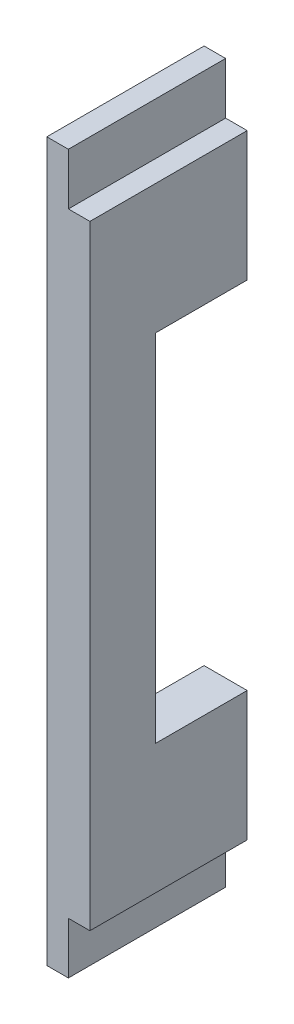
ISO-10303-21;
HEADER;
FILE_DESCRIPTION(('STEP AP214'),'2;1');
FILE_NAME('part.step','',(''),(''),'','','');
FILE_SCHEMA(('AUTOMOTIVE_DESIGN { 1 0 10303 214 1 1 1 1 }'));
ENDSEC;
DATA;
#1=APPLICATION_CONTEXT('core data for automotive mechanical design processes');
#2=APPLICATION_PROTOCOL_DEFINITION('international standard','automotive_design',2000,#1);
#3=PRODUCT_CONTEXT('',#1,'mechanical');
#4=PRODUCT('Part','Part','',(#3));
#5=PRODUCT_RELATED_PRODUCT_CATEGORY('part','',(#4));
#6=PRODUCT_DEFINITION_FORMATION('','',#4);
#7=PRODUCT_DEFINITION_CONTEXT('part definition',#1,'design');
#8=PRODUCT_DEFINITION('design','',#6,#7);
#9=PRODUCT_DEFINITION_SHAPE('','',#8);
#10=(LENGTH_UNIT() NAMED_UNIT(*) SI_UNIT(.MILLI.,.METRE.));
#11=(NAMED_UNIT(*) PLANE_ANGLE_UNIT() SI_UNIT($,.RADIAN.));
#12=(NAMED_UNIT(*) SI_UNIT($,.STERADIAN.) SOLID_ANGLE_UNIT());
#13=UNCERTAINTY_MEASURE_WITH_UNIT(LENGTH_MEASURE(1.E-05),#10,'distance_accuracy_value','');
#14=(GEOMETRIC_REPRESENTATION_CONTEXT(3) GLOBAL_UNCERTAINTY_ASSIGNED_CONTEXT((#13)) GLOBAL_UNIT_ASSIGNED_CONTEXT((#10,
#11,#12)) REPRESENTATION_CONTEXT('',''));
#15=CARTESIAN_POINT('',(0.,0.,0.));
#16=DIRECTION('',(0.,0.,1.));
#17=DIRECTION('',(1.,0.,0.));
#18=AXIS2_PLACEMENT_3D('',#15,#16,#17);
#19=CARTESIAN_POINT('',(-196.686091028777,-278.025070596186,-866.48578652296));
#20=DIRECTION('',(0.,1.,0.));
#21=DIRECTION('',(-1.,0.,0.));
#22=AXIS2_PLACEMENT_3D('',#19,#20,#21);
#23=PLANE('',#22);
#24=DIRECTION('',(1.,0.,0.));
#25=VECTOR('',#24,1.);
#26=CARTESIAN_POINT('',(-316.686091028779,-278.025070596186,-899.48578652296));
#27=LINE('',#26,#25);
#28=CARTESIAN_POINT('',(-306.686091028778,-278.025070596186,-899.48578652296));
#29=VERTEX_POINT('',#28);
#30=CARTESIAN_POINT('',(-316.686091028776,-278.025070596186,-899.48578652296));
#31=VERTEX_POINT('',#30);
#32=EDGE_CURVE('E120',#29,#31,#27,.F.);
#33=ORIENTED_EDGE('',*,*,#32,.T.);
#34=DIRECTION('',(0.,0.,1.));
#35=VECTOR('',#34,1.);
#36=CARTESIAN_POINT('',(-316.686091028776,-278.025070596186,-866.48578652296));
#37=LINE('',#36,#35);
#38=CARTESIAN_POINT('',(-316.686091028776,-278.025070596186,-826.485786522959));
#39=VERTEX_POINT('',#38);
#40=EDGE_CURVE('E121',#39,#31,#37,.F.);
#41=ORIENTED_EDGE('',*,*,#40,.F.);
#42=DIRECTION('',(-1.,0.,0.));
#43=VECTOR('',#42,1.);
#44=CARTESIAN_POINT('',(-316.686091028776,-278.025070596186,-826.485786522959));
#45=LINE('',#44,#43);
#46=CARTESIAN_POINT('',(-306.686091028778,-278.025070596186,-826.485786522959));
#47=VERTEX_POINT('',#46);
#48=EDGE_CURVE('E137',#39,#47,#45,.F.);
#49=ORIENTED_EDGE('',*,*,#48,.T.);
#50=DIRECTION('',(0.,0.,1.));
#51=VECTOR('',#50,1.);
#52=CARTESIAN_POINT('',(-306.686091028778,-278.025070596186,-868.98578652296));
#53=LINE('',#52,#51);
#54=EDGE_CURVE('E147',#47,#29,#53,.F.);
#55=ORIENTED_EDGE('',*,*,#54,.T.);
#56=EDGE_LOOP('',(#33,#41,#49,#55));
#57=FACE_BOUND('',#56,.T.);
#58=ADVANCED_FACE('F17',(#57),#23,.T.);
#59=CARTESIAN_POINT('',(-306.686091028778,-420.602297752566,-868.98578652296));
#60=DIRECTION('',(-1.,0.,0.));
#61=DIRECTION('',(0.,0.,1.));
#62=AXIS2_PLACEMENT_3D('',#59,#60,#61);
#63=PLANE('',#62);
#64=DIRECTION('',(0.,1.,0.));
#65=VECTOR('',#64,1.);
#66=CARTESIAN_POINT('',(-306.686091028778,-420.602297752566,-826.485786522959));
#67=LINE('',#66,#65);
#68=CARTESIAN_POINT('',(-306.686091028778,-563.179524908949,-826.485786522959));
#69=VERTEX_POINT('',#68);
#70=EDGE_CURVE('E134',#47,#69,#67,.F.);
#71=ORIENTED_EDGE('',*,*,#70,.T.);
#72=DIRECTION('',(0.,0.,-1.));
#73=VECTOR('',#72,1.);
#74=CARTESIAN_POINT('',(-306.686091028778,-563.179524908949,-866.48578652296));
#75=LINE('',#74,#73);
#76=CARTESIAN_POINT('',(-306.686091028778,-563.179524908949,-899.48578652296));
#77=VERTEX_POINT('',#76);
#78=EDGE_CURVE('E149',#77,#69,#75,.F.);
#79=ORIENTED_EDGE('',*,*,#78,.F.);
#80=DIRECTION('',(0.,1.,0.));
#81=VECTOR('',#80,1.);
#82=CARTESIAN_POINT('',(-306.686091028778,-420.602297752566,-899.48578652296));
#83=LINE('',#82,#81);
#84=CARTESIAN_POINT('',(-306.686092270153,-503.102285385131,-899.48578652296));
#85=VERTEX_POINT('',#84);
#86=EDGE_CURVE('E179',#77,#85,#83,.T.);
#87=ORIENTED_EDGE('',*,*,#86,.T.);
#88=DIRECTION('',(0.,0.,-1.));
#89=VECTOR('',#88,1.);
#90=CARTESIAN_POINT('',(-306.686095994277,-503.102285385131,-881.985844802857));
#91=LINE('',#90,#89);
#92=CARTESIAN_POINT('',(-306.686091028778,-503.102285385131,-856.985868835449));
#93=VERTEX_POINT('',#92);
#94=EDGE_CURVE('E131',#85,#93,#91,.F.);
#95=ORIENTED_EDGE('',*,*,#94,.T.);
#96=DIRECTION('',(0.,1.,0.));
#97=VECTOR('',#96,1.);
#98=CARTESIAN_POINT('',(-306.686091028778,-420.602282333374,-856.985868835449));
#99=LINE('',#98,#97);
#100=CARTESIAN_POINT('',(-306.686091028778,-338.102279281615,-856.985868835449));
#101=VERTEX_POINT('',#100);
#102=EDGE_CURVE('E103',#93,#101,#99,.T.);
#103=ORIENTED_EDGE('',*,*,#102,.T.);
#104=DIRECTION('',(0.,0.,1.));
#105=VECTOR('',#104,1.);
#106=CARTESIAN_POINT('',(-306.686091028778,-338.102279281615,-868.98578652296));
#107=LINE('',#106,#105);
#108=CARTESIAN_POINT('',(-306.686091028778,-338.102279281615,-899.48578652296));
#109=VERTEX_POINT('',#108);
#110=EDGE_CURVE('E20',#101,#109,#107,.F.);
#111=ORIENTED_EDGE('',*,*,#110,.T.);
#112=DIRECTION('',(0.,1.,0.));
#113=VECTOR('',#112,1.);
#114=CARTESIAN_POINT('',(-306.686091028778,-420.602297752566,-899.48578652296));
#115=LINE('',#114,#113);
#116=EDGE_CURVE('E109',#109,#29,#115,.T.);
#117=ORIENTED_EDGE('',*,*,#116,.T.);
#118=ORIENTED_EDGE('',*,*,#54,.F.);
#119=EDGE_LOOP('',(#71,#79,#87,#95,#103,#111,#117,#118));
#120=FACE_BOUND('',#119,.T.);
#121=ADVANCED_FACE('F107',(#120),#63,.F.);
#122=CARTESIAN_POINT('',(-196.679347611489,-563.179524908949,-866.48578652296));
#123=DIRECTION('',(0.,-1.,0.));
#124=DIRECTION('',(0.,0.,-1.));
#125=AXIS2_PLACEMENT_3D('',#122,#123,#124);
#126=PLANE('',#125);
#127=DIRECTION('',(1.,0.,0.));
#128=VECTOR('',#127,1.);
#129=CARTESIAN_POINT('',(-316.686091028776,-563.179524908949,-899.48578652296));
#130=LINE('',#129,#128);
#131=CARTESIAN_POINT('',(-316.679347611488,-563.179524908949,-899.48578652296));
#132=VERTEX_POINT('',#131);
#133=EDGE_CURVE('E159',#132,#77,#130,.T.);
#134=ORIENTED_EDGE('',*,*,#133,.T.);
#135=ORIENTED_EDGE('',*,*,#78,.T.);
#136=DIRECTION('',(-1.,0.,0.));
#137=VECTOR('',#136,1.);
#138=CARTESIAN_POINT('',(-316.686091028776,-563.179524908949,-826.485786522959));
#139=LINE('',#138,#137);
#140=CARTESIAN_POINT('',(-316.679347611488,-563.179524908949,-826.485786522959));
#141=VERTEX_POINT('',#140);
#142=EDGE_CURVE('E136',#69,#141,#139,.T.);
#143=ORIENTED_EDGE('',*,*,#142,.T.);
#144=DIRECTION('',(0.,0.,1.));
#145=VECTOR('',#144,1.);
#146=CARTESIAN_POINT('',(-316.679347611488,-563.179524908949,-866.48578652296));
#147=LINE('',#146,#145);
#148=EDGE_CURVE('E172',#141,#132,#147,.F.);
#149=ORIENTED_EDGE('',*,*,#148,.T.);
#150=EDGE_LOOP('',(#134,#135,#143,#149));
#151=FACE_BOUND('',#150,.T.);
#152=ADVANCED_FACE('F229',(#151),#126,.T.);
#153=CARTESIAN_POINT('',(-316.679347611488,-575.179524908949,-866.48578652296));
#154=DIRECTION('',(-1.,0.,0.));
#155=DIRECTION('',(0.,0.,1.));
#156=AXIS2_PLACEMENT_3D('',#153,#154,#155);
#157=PLANE('',#156);
#158=DIRECTION('',(0.,0.,1.));
#159=VECTOR('',#158,1.);
#160=CARTESIAN_POINT('',(-316.679347611488,-587.179524908949,-868.98578652296));
#161=LINE('',#160,#159);
#162=CARTESIAN_POINT('',(-316.679347611488,-587.179524908949,-826.485786522959));
#163=VERTEX_POINT('',#162);
#164=CARTESIAN_POINT('',(-316.679347611488,-587.179524908949,-899.48578652296));
#165=VERTEX_POINT('',#164);
#166=EDGE_CURVE('E141',#163,#165,#161,.F.);
#167=ORIENTED_EDGE('',*,*,#166,.T.);
#168=DIRECTION('',(0.,1.,0.));
#169=VECTOR('',#168,1.);
#170=CARTESIAN_POINT('',(-316.679347611488,-420.602297752566,-899.48578652296));
#171=LINE('',#170,#169);
#172=EDGE_CURVE('E183',#165,#132,#171,.T.);
#173=ORIENTED_EDGE('',*,*,#172,.T.);
#174=ORIENTED_EDGE('',*,*,#148,.F.);
#175=DIRECTION('',(0.,1.,0.));
#176=VECTOR('',#175,1.);
#177=CARTESIAN_POINT('',(-316.679347611488,-420.602297752566,-826.485786522959));
#178=LINE('',#177,#176);
#179=EDGE_CURVE('E191',#141,#163,#178,.F.);
#180=ORIENTED_EDGE('',*,*,#179,.T.);
#181=EDGE_LOOP('',(#167,#173,#174,#180));
#182=FACE_BOUND('',#181,.T.);
#183=ADVANCED_FACE('F225',(#182),#157,.F.);
#184=CARTESIAN_POINT('',(-316.686091028776,-266.025070596186,-866.48578652296));
#185=DIRECTION('',(1.,0.,0.));
#186=DIRECTION('',(0.,1.,0.));
#187=AXIS2_PLACEMENT_3D('',#184,#185,#186);
#188=PLANE('',#187);
#189=DIRECTION('',(0.,1.,0.));
#190=VECTOR('',#189,1.);
#191=CARTESIAN_POINT('',(-316.686091028776,-420.602297752566,-899.48578652296));
#192=LINE('',#191,#190);
#193=CARTESIAN_POINT('',(-316.686091028776,-254.025070596186,-899.48578652296));
#194=VERTEX_POINT('',#193);
#195=EDGE_CURVE('E115',#31,#194,#192,.T.);
#196=ORIENTED_EDGE('',*,*,#195,.T.);
#197=DIRECTION('',(0.,0.,-1.));
#198=VECTOR('',#197,1.);
#199=CARTESIAN_POINT('',(-316.686091028776,-254.025070596186,-868.98578652296));
#200=LINE('',#199,#198);
#201=CARTESIAN_POINT('',(-316.686091028776,-254.025070596186,-826.485786522959));
#202=VERTEX_POINT('',#201);
#203=EDGE_CURVE('E154',#194,#202,#200,.F.);
#204=ORIENTED_EDGE('',*,*,#203,.T.);
#205=DIRECTION('',(0.,1.,0.));
#206=VECTOR('',#205,1.);
#207=CARTESIAN_POINT('',(-316.686091028776,-420.602297752566,-826.485786522959));
#208=LINE('',#207,#206);
#209=EDGE_CURVE('E195',#202,#39,#208,.F.);
#210=ORIENTED_EDGE('',*,*,#209,.T.);
#211=ORIENTED_EDGE('',*,*,#40,.T.);
#212=EDGE_LOOP('',(#196,#204,#210,#211));
#213=FACE_BOUND('',#212,.T.);
#214=ADVANCED_FACE('F235',(#213),#188,.T.);
#215=CARTESIAN_POINT('',(-316.686091028779,-420.602297752566,-899.48578652296));
#216=DIRECTION('',(0.,0.,1.));
#217=DIRECTION('',(1.,0.,0.));
#218=AXIS2_PLACEMENT_3D('',#215,#216,#217);
#219=PLANE('',#218);
#220=ORIENTED_EDGE('',*,*,#32,.F.);
#221=ORIENTED_EDGE('',*,*,#116,.F.);
#222=DIRECTION('',(1.,0.,0.));
#223=VECTOR('',#222,1.);
#224=CARTESIAN_POINT('',(-316.686091028779,-338.102279281615,-899.48578652296));
#225=LINE('',#224,#223);
#226=CARTESIAN_POINT('',(-326.686091028777,-338.102279281615,-899.48578652296));
#227=VERTEX_POINT('',#226);
#228=EDGE_CURVE('E114',#109,#227,#225,.F.);
#229=ORIENTED_EDGE('',*,*,#228,.T.);
#230=DIRECTION('',(0.,1.,0.));
#231=VECTOR('',#230,1.);
#232=CARTESIAN_POINT('',(-326.686091028777,-420.602297752566,-899.48578652296));
#233=LINE('',#232,#231);
#234=CARTESIAN_POINT('',(-326.686091028777,-254.025070596186,-899.48578652296));
#235=VERTEX_POINT('',#234);
#236=EDGE_CURVE('E152',#235,#227,#233,.F.);
#237=ORIENTED_EDGE('',*,*,#236,.F.);
#238=DIRECTION('',(1.,0.,0.));
#239=VECTOR('',#238,1.);
#240=CARTESIAN_POINT('',(-316.686091028776,-254.025070596186,-899.48578652296));
#241=LINE('',#240,#239);
#242=EDGE_CURVE('E199',#235,#194,#241,.T.);
#243=ORIENTED_EDGE('',*,*,#242,.T.);
#244=ORIENTED_EDGE('',*,*,#195,.F.);
#245=EDGE_LOOP('',(#220,#221,#229,#237,#243,#244));
#246=FACE_BOUND('',#245,.T.);
#247=ADVANCED_FACE('F117',(#246),#219,.F.);
#248=CARTESIAN_POINT('',(-306.686100959777,-338.102279281615,-881.985844802857));
#249=DIRECTION('',(0.,1.,0.));
#250=DIRECTION('',(0.,0.,1.));
#251=AXIS2_PLACEMENT_3D('',#248,#249,#250);
#252=PLANE('',#251);
#253=ORIENTED_EDGE('',*,*,#110,.F.);
#254=DIRECTION('',(1.,0.,0.));
#255=VECTOR('',#254,1.);
#256=CARTESIAN_POINT('',(-306.686100959777,-338.102279281615,-856.985868835449));
#257=LINE('',#256,#255);
#258=CARTESIAN_POINT('',(-326.686091028777,-338.102279281615,-856.985868835449));
#259=VERTEX_POINT('',#258);
#260=EDGE_CURVE('E127',#101,#259,#257,.F.);
#261=ORIENTED_EDGE('',*,*,#260,.T.);
#262=DIRECTION('',(0.,0.,1.));
#263=VECTOR('',#262,1.);
#264=CARTESIAN_POINT('',(-326.686091028777,-338.102279281615,-868.98578652296));
#265=LINE('',#264,#263);
#266=EDGE_CURVE('E125',#227,#259,#265,.T.);
#267=ORIENTED_EDGE('',*,*,#266,.F.);
#268=ORIENTED_EDGE('',*,*,#228,.F.);
#269=EDGE_LOOP('',(#253,#261,#267,#268));
#270=FACE_BOUND('',#269,.T.);
#271=ADVANCED_FACE('F123',(#270),#252,.F.);
#272=CARTESIAN_POINT('',(-306.686100959777,-420.602282333374,-856.985868835449));
#273=DIRECTION('',(0.,0.,1.));
#274=DIRECTION('',(1.,0.,0.));
#275=AXIS2_PLACEMENT_3D('',#272,#273,#274);
#276=PLANE('',#275);
#277=ORIENTED_EDGE('',*,*,#260,.F.);
#278=ORIENTED_EDGE('',*,*,#102,.F.);
#279=DIRECTION('',(1.,0.,0.));
#280=VECTOR('',#279,1.);
#281=CARTESIAN_POINT('',(-306.686100959777,-503.102285385131,-856.985868835449));
#282=LINE('',#281,#280);
#283=CARTESIAN_POINT('',(-326.686091028777,-503.102285385131,-856.985868835449));
#284=VERTEX_POINT('',#283);
#285=EDGE_CURVE('E157',#93,#284,#282,.F.);
#286=ORIENTED_EDGE('',*,*,#285,.T.);
#287=DIRECTION('',(0.,1.,0.));
#288=VECTOR('',#287,1.);
#289=CARTESIAN_POINT('',(-326.686091028777,-420.602297752566,-856.985868835449));
#290=LINE('',#289,#288);
#291=EDGE_CURVE('E164',#259,#284,#290,.F.);
#292=ORIENTED_EDGE('',*,*,#291,.F.);
#293=EDGE_LOOP('',(#277,#278,#286,#292));
#294=FACE_BOUND('',#293,.T.);
#295=ADVANCED_FACE('F243',(#294),#276,.F.);
#296=CARTESIAN_POINT('',(-306.686100959777,-503.102285385131,-881.985844802857));
#297=DIRECTION('',(0.,-1.,0.));
#298=DIRECTION('',(0.,0.,-1.));
#299=AXIS2_PLACEMENT_3D('',#296,#297,#298);
#300=PLANE('',#299);
#301=DIRECTION('',(0.,0.,1.));
#302=VECTOR('',#301,1.);
#303=CARTESIAN_POINT('',(-326.686091028777,-503.102285385131,-868.98578652296));
#304=LINE('',#303,#302);
#305=CARTESIAN_POINT('',(-326.686091028777,-503.102285385131,-899.48578652296));
#306=VERTEX_POINT('',#305);
#307=EDGE_CURVE('E167',#284,#306,#304,.F.);
#308=ORIENTED_EDGE('',*,*,#307,.F.);
#309=ORIENTED_EDGE('',*,*,#285,.F.);
#310=ORIENTED_EDGE('',*,*,#94,.F.);
#311=DIRECTION('',(1.,0.,0.));
#312=VECTOR('',#311,1.);
#313=CARTESIAN_POINT('',(-316.686091028776,-503.102285385131,-899.48578652296));
#314=LINE('',#313,#312);
#315=EDGE_CURVE('E181',#85,#306,#314,.F.);
#316=ORIENTED_EDGE('',*,*,#315,.T.);
#317=EDGE_LOOP('',(#308,#309,#310,#316));
#318=FACE_BOUND('',#317,.T.);
#319=ADVANCED_FACE('F247',(#318),#300,.F.);
#320=CARTESIAN_POINT('',(-316.686091028776,-420.602297752566,-899.48578652296));
#321=DIRECTION('',(0.,0.,1.));
#322=DIRECTION('',(1.,0.,0.));
#323=AXIS2_PLACEMENT_3D('',#320,#321,#322);
#324=PLANE('',#323);
#325=DIRECTION('',(1.,0.,0.));
#326=VECTOR('',#325,1.);
#327=CARTESIAN_POINT('',(-316.686091028776,-587.179524908949,-899.48578652296));
#328=LINE('',#327,#326);
#329=CARTESIAN_POINT('',(-326.686091028777,-587.179524908949,-899.48578652296));
#330=VERTEX_POINT('',#329);
#331=EDGE_CURVE('E186',#165,#330,#328,.F.);
#332=ORIENTED_EDGE('',*,*,#331,.T.);
#333=DIRECTION('',(0.,1.,0.));
#334=VECTOR('',#333,1.);
#335=CARTESIAN_POINT('',(-326.686091028777,-420.602297752566,-899.48578652296));
#336=LINE('',#335,#334);
#337=EDGE_CURVE('E206',#306,#330,#336,.F.);
#338=ORIENTED_EDGE('',*,*,#337,.F.);
#339=ORIENTED_EDGE('',*,*,#315,.F.);
#340=ORIENTED_EDGE('',*,*,#86,.F.);
#341=ORIENTED_EDGE('',*,*,#133,.F.);
#342=ORIENTED_EDGE('',*,*,#172,.F.);
#343=EDGE_LOOP('',(#332,#338,#339,#340,#341,#342));
#344=FACE_BOUND('',#343,.T.);
#345=ADVANCED_FACE('F251',(#344),#324,.F.);
#346=CARTESIAN_POINT('',(-316.686091028776,-587.179524908949,-868.98578652296));
#347=DIRECTION('',(0.,1.,0.));
#348=DIRECTION('',(0.,0.,1.));
#349=AXIS2_PLACEMENT_3D('',#346,#347,#348);
#350=PLANE('',#349);
#351=DIRECTION('',(-1.,0.,0.));
#352=VECTOR('',#351,1.);
#353=CARTESIAN_POINT('',(-316.686091028776,-587.179524908949,-826.485786522959));
#354=LINE('',#353,#352);
#355=CARTESIAN_POINT('',(-326.686091028777,-587.179524908949,-826.485786522959));
#356=VERTEX_POINT('',#355);
#357=EDGE_CURVE('E193',#163,#356,#354,.T.);
#358=ORIENTED_EDGE('',*,*,#357,.T.);
#359=DIRECTION('',(0.,0.,1.));
#360=VECTOR('',#359,1.);
#361=CARTESIAN_POINT('',(-326.686091028777,-587.179524908949,-868.98578652296));
#362=LINE('',#361,#360);
#363=EDGE_CURVE('E209',#330,#356,#362,.T.);
#364=ORIENTED_EDGE('',*,*,#363,.F.);
#365=ORIENTED_EDGE('',*,*,#331,.F.);
#366=ORIENTED_EDGE('',*,*,#166,.F.);
#367=EDGE_LOOP('',(#358,#364,#365,#366));
#368=FACE_BOUND('',#367,.T.);
#369=ADVANCED_FACE('F222',(#368),#350,.F.);
#370=CARTESIAN_POINT('',(-316.686091028776,-420.602297752566,-826.485786522959));
#371=DIRECTION('',(0.,0.,-1.));
#372=DIRECTION('',(-1.,0.,0.));
#373=AXIS2_PLACEMENT_3D('',#370,#371,#372);
#374=PLANE('',#373);
#375=DIRECTION('',(1.,0.,0.));
#376=VECTOR('',#375,1.);
#377=CARTESIAN_POINT('',(-316.686091028776,-254.025070596186,-826.485786522959));
#378=LINE('',#377,#376);
#379=CARTESIAN_POINT('',(-326.686091028777,-254.025070596186,-826.485786522959));
#380=VERTEX_POINT('',#379);
#381=EDGE_CURVE('E35',#202,#380,#378,.F.);
#382=ORIENTED_EDGE('',*,*,#381,.T.);
#383=DIRECTION('',(0.,1.,0.));
#384=VECTOR('',#383,1.);
#385=CARTESIAN_POINT('',(-326.686091028777,-420.602297752566,-826.485786522959));
#386=LINE('',#385,#384);
#387=EDGE_CURVE('E26',#356,#380,#386,.T.);
#388=ORIENTED_EDGE('',*,*,#387,.F.);
#389=ORIENTED_EDGE('',*,*,#357,.F.);
#390=ORIENTED_EDGE('',*,*,#179,.F.);
#391=ORIENTED_EDGE('',*,*,#142,.F.);
#392=ORIENTED_EDGE('',*,*,#70,.F.);
#393=ORIENTED_EDGE('',*,*,#48,.F.);
#394=ORIENTED_EDGE('',*,*,#209,.F.);
#395=EDGE_LOOP('',(#382,#388,#389,#390,#391,#392,#393,#394));
#396=FACE_BOUND('',#395,.T.);
#397=ADVANCED_FACE('F217',(#396),#374,.F.);
#398=CARTESIAN_POINT('',(-316.686091028776,-254.025070596186,-868.98578652296));
#399=DIRECTION('',(0.,-1.,0.));
#400=DIRECTION('',(0.,0.,-1.));
#401=AXIS2_PLACEMENT_3D('',#398,#399,#400);
#402=PLANE('',#401);
#403=ORIENTED_EDGE('',*,*,#242,.F.);
#404=DIRECTION('',(0.,0.,1.));
#405=VECTOR('',#404,1.);
#406=CARTESIAN_POINT('',(-326.686091028777,-254.025070596186,-868.98578652296));
#407=LINE('',#406,#405);
#408=EDGE_CURVE('E11',#380,#235,#407,.F.);
#409=ORIENTED_EDGE('',*,*,#408,.F.);
#410=ORIENTED_EDGE('',*,*,#381,.F.);
#411=ORIENTED_EDGE('',*,*,#203,.F.);
#412=EDGE_LOOP('',(#403,#409,#410,#411));
#413=FACE_BOUND('',#412,.T.);
#414=ADVANCED_FACE('F239',(#413),#402,.F.);
#415=CARTESIAN_POINT('',(-326.686091028777,-420.602297752566,-868.98578652296));
#416=DIRECTION('',(-1.,0.,0.));
#417=DIRECTION('',(0.,0.,1.));
#418=AXIS2_PLACEMENT_3D('',#415,#416,#417);
#419=PLANE('',#418);
#420=ORIENTED_EDGE('',*,*,#387,.T.);
#421=ORIENTED_EDGE('',*,*,#408,.T.);
#422=ORIENTED_EDGE('',*,*,#236,.T.);
#423=ORIENTED_EDGE('',*,*,#266,.T.);
#424=ORIENTED_EDGE('',*,*,#291,.T.);
#425=ORIENTED_EDGE('',*,*,#307,.T.);
#426=ORIENTED_EDGE('',*,*,#337,.T.);
#427=ORIENTED_EDGE('',*,*,#363,.T.);
#428=EDGE_LOOP('',(#420,#421,#422,#423,#424,#425,#426,#427));
#429=FACE_BOUND('',#428,.T.);
#430=ADVANCED_FACE('F214',(#429),#419,.T.);
#431=CLOSED_SHELL('',(#58,#121,#152,#183,#214,#247,#271,#295,#319,#345,#369,#397,#414,#430));
#432=MANIFOLD_SOLID_BREP('B1',#431);
#433=ADVANCED_BREP_SHAPE_REPRESENTATION('',(#18,#432),#14);
#434=SHAPE_DEFINITION_REPRESENTATION(#9,#433);
ENDSEC;
END-ISO-10303-21;
